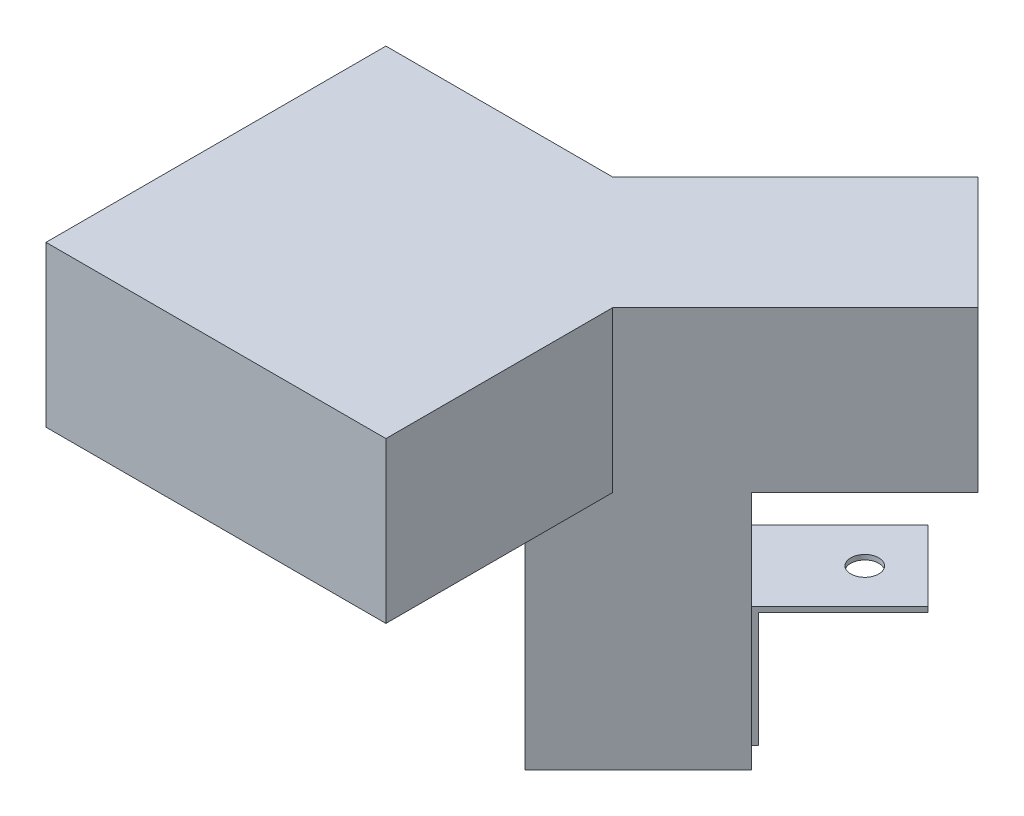
ISO-10303-21;
HEADER;
FILE_DESCRIPTION(('STEP AP214'),'2;1');
FILE_NAME('part.step','',(''),(''),'','','');
FILE_SCHEMA(('AUTOMOTIVE_DESIGN { 1 0 10303 214 1 1 1 1 }'));
ENDSEC;
DATA;
#1=APPLICATION_CONTEXT('core data for automotive mechanical design processes');
#2=APPLICATION_PROTOCOL_DEFINITION('international standard','automotive_design',2000,#1);
#3=PRODUCT_CONTEXT('',#1,'mechanical');
#4=PRODUCT('Part','Part','',(#3));
#5=PRODUCT_RELATED_PRODUCT_CATEGORY('part','',(#4));
#6=PRODUCT_DEFINITION_FORMATION('','',#4);
#7=PRODUCT_DEFINITION_CONTEXT('part definition',#1,'design');
#8=PRODUCT_DEFINITION('design','',#6,#7);
#9=PRODUCT_DEFINITION_SHAPE('','',#8);
#10=(LENGTH_UNIT() NAMED_UNIT(*) SI_UNIT(.MILLI.,.METRE.));
#11=(NAMED_UNIT(*) PLANE_ANGLE_UNIT() SI_UNIT($,.RADIAN.));
#12=(NAMED_UNIT(*) SI_UNIT($,.STERADIAN.) SOLID_ANGLE_UNIT());
#13=UNCERTAINTY_MEASURE_WITH_UNIT(LENGTH_MEASURE(1.E-05),#10,'distance_accuracy_value','');
#14=(GEOMETRIC_REPRESENTATION_CONTEXT(3) GLOBAL_UNCERTAINTY_ASSIGNED_CONTEXT((#13)) GLOBAL_UNIT_ASSIGNED_CONTEXT((#10,
#11,#12)) REPRESENTATION_CONTEXT('',''));
#15=CARTESIAN_POINT('',(0.,0.,0.));
#16=DIRECTION('',(0.,0.,1.));
#17=DIRECTION('',(1.,0.,0.));
#18=AXIS2_PLACEMENT_3D('',#15,#16,#17);
#19=CARTESIAN_POINT('',(-435.867200615114,0.,435.867200615114));
#20=DIRECTION('',(0.707106781186548,0.,-0.707106781186548));
#21=DIRECTION('',(-0.707106781186548,0.,-0.707106781186548));
#22=AXIS2_PLACEMENT_3D('',#19,#20,#21);
#23=PLANE('',#22);
#24=DIRECTION('',(0.,1.,0.));
#25=VECTOR('',#24,1.);
#26=CARTESIAN_POINT('',(-444.706035379946,-130.,427.028365850282));
#27=LINE('',#26,#25);
#28=CARTESIAN_POINT('',(-444.706035379946,-130.,427.028365850282));
#29=VERTEX_POINT('',#28);
#30=CARTESIAN_POINT('',(-444.706035379946,-101.2,427.028365850282));
#31=VERTEX_POINT('',#30);
#32=EDGE_CURVE('E193',#29,#31,#27,.T.);
#33=ORIENTED_EDGE('',*,*,#32,.T.);
#34=DIRECTION('',(-0.707106781186547,0.,-0.707106781186547));
#35=VECTOR('',#34,1.);
#36=CARTESIAN_POINT('',(-444.706035379946,-101.2,427.028365850282));
#37=LINE('',#36,#35);
#38=CARTESIAN_POINT('',(-427.028365850282,-101.2,444.706035379946));
#39=VERTEX_POINT('',#38);
#40=EDGE_CURVE('E179',#39,#31,#37,.T.);
#41=ORIENTED_EDGE('',*,*,#40,.F.);
#42=DIRECTION('',(0.,-1.,0.));
#43=VECTOR('',#42,1.);
#44=CARTESIAN_POINT('',(-427.028365850282,-100.,444.706035379946));
#45=LINE('',#44,#43);
#46=CARTESIAN_POINT('',(-427.028365850282,-130.,444.706035379946));
#47=VERTEX_POINT('',#46);
#48=EDGE_CURVE('E197',#39,#47,#45,.T.);
#49=ORIENTED_EDGE('',*,*,#48,.T.);
#50=DIRECTION('',(-0.707106781186547,0.,-0.707106781186547));
#51=VECTOR('',#50,1.);
#52=CARTESIAN_POINT('',(-427.028365850282,-130.,444.706035379946));
#53=LINE('',#52,#51);
#54=EDGE_CURVE('E190',#47,#29,#53,.T.);
#55=ORIENTED_EDGE('',*,*,#54,.T.);
#56=EDGE_LOOP('',(#33,#41,#49,#55));
#57=FACE_BOUND('',#56,.T.);
#58=ADVANCED_FACE('F34',(#57),#23,.T.);
#59=CARTESIAN_POINT('',(-450.857864376269,-130.,422.573593128807));
#60=DIRECTION('',(0.707106781186547,0.,-0.707106781186548));
#61=DIRECTION('',(-0.707106781186548,0.,-0.707106781186547));
#62=AXIS2_PLACEMENT_3D('',#59,#60,#61);
#63=PLANE('',#62);
#64=DIRECTION('',(-0.707106781186547,0.,-0.707106781186547));
#65=VECTOR('',#64,1.);
#66=CARTESIAN_POINT('',(-427.876893987706,-100.,445.55456351737));
#67=LINE('',#66,#65);
#68=CARTESIAN_POINT('',(-427.876893987706,-100.,445.55456351737));
#69=VERTEX_POINT('',#68);
#70=CARTESIAN_POINT('',(-445.55456351737,-100.,427.876893987706));
#71=VERTEX_POINT('',#70);
#72=EDGE_CURVE('E200',#69,#71,#67,.T.);
#73=ORIENTED_EDGE('',*,*,#72,.T.);
#74=DIRECTION('',(0.,1.,0.));
#75=VECTOR('',#74,1.);
#76=CARTESIAN_POINT('',(-445.55456351737,-130.,427.876893987706));
#77=LINE('',#76,#75);
#78=CARTESIAN_POINT('',(-445.55456351737,-130.,427.876893987706));
#79=VERTEX_POINT('',#78);
#80=EDGE_CURVE('E162',#79,#71,#77,.T.);
#81=ORIENTED_EDGE('',*,*,#80,.F.);
#82=DIRECTION('',(0.707106781186548,0.,0.707106781186547));
#83=VECTOR('',#82,1.);
#84=CARTESIAN_POINT('',(-450.857864376269,-130.,422.573593128807));
#85=LINE('',#84,#83);
#86=CARTESIAN_POINT('',(-450.857864376269,-130.,422.573593128807));
#87=VERTEX_POINT('',#86);
#88=EDGE_CURVE('E281',#87,#79,#85,.T.);
#89=ORIENTED_EDGE('',*,*,#88,.F.);
#90=DIRECTION('',(0.,1.,0.));
#91=VECTOR('',#90,1.);
#92=CARTESIAN_POINT('',(-450.857864376269,-130.,422.573593128807));
#93=LINE('',#92,#91);
#94=CARTESIAN_POINT('',(-450.857864376269,-70.,422.573593128807));
#95=VERTEX_POINT('',#94);
#96=EDGE_CURVE('E261',#87,#95,#93,.T.);
#97=ORIENTED_EDGE('',*,*,#96,.T.);
#98=DIRECTION('',(0.707106781186548,0.,0.707106781186547));
#99=VECTOR('',#98,1.);
#100=CARTESIAN_POINT('',(-450.857864376269,-70.,422.573593128807));
#101=LINE('',#100,#99);
#102=CARTESIAN_POINT('',(-422.573593128807,-70.,450.857864376269));
#103=VERTEX_POINT('',#102);
#104=EDGE_CURVE('E279',#95,#103,#101,.T.);
#105=ORIENTED_EDGE('',*,*,#104,.T.);
#106=DIRECTION('',(0.,1.,0.));
#107=VECTOR('',#106,1.);
#108=CARTESIAN_POINT('',(-422.573593128807,-130.,450.857864376269));
#109=LINE('',#108,#107);
#110=CARTESIAN_POINT('',(-422.573593128807,-130.,450.857864376269));
#111=VERTEX_POINT('',#110);
#112=EDGE_CURVE('E244',#111,#103,#109,.T.);
#113=ORIENTED_EDGE('',*,*,#112,.F.);
#114=CARTESIAN_POINT('',(-427.876893987706,-130.,445.55456351737));
#115=VERTEX_POINT('',#114);
#116=EDGE_CURVE('E284',#115,#111,#85,.T.);
#117=ORIENTED_EDGE('',*,*,#116,.F.);
#118=DIRECTION('',(0.,-1.,0.));
#119=VECTOR('',#118,1.);
#120=CARTESIAN_POINT('',(-427.876893987706,-100.,445.55456351737));
#121=LINE('',#120,#119);
#122=EDGE_CURVE('E194',#69,#115,#121,.T.);
#123=ORIENTED_EDGE('',*,*,#122,.F.);
#124=EDGE_LOOP('',(#73,#81,#89,#97,#105,#113,#117,#123));
#125=FACE_BOUND('',#124,.T.);
#126=ADVANCED_FACE('F335',(#125),#63,.T.);
#127=CARTESIAN_POINT('',(-479.142135623731,-30.,450.857864376269));
#128=DIRECTION('',(-0.707106781186547,0.,0.707106781186548));
#129=DIRECTION('',(0.707106781186548,0.,0.707106781186547));
#130=AXIS2_PLACEMENT_3D('',#127,#128,#129);
#131=PLANE('',#130);
#132=DIRECTION('',(0.,-1.,0.));
#133=VECTOR('',#132,1.);
#134=CARTESIAN_POINT('',(-450.857864376269,-30.,479.142135623731));
#135=LINE('',#134,#133);
#136=CARTESIAN_POINT('',(-450.857864376269,-70.,479.142135623731));
#137=VERTEX_POINT('',#136);
#138=CARTESIAN_POINT('',(-450.857864376269,-130.,479.142135623731));
#139=VERTEX_POINT('',#138);
#140=EDGE_CURVE('E239',#137,#139,#135,.T.);
#141=ORIENTED_EDGE('',*,*,#140,.F.);
#142=DIRECTION('',(-0.707106781186548,0.,-0.707106781186547));
#143=VECTOR('',#142,1.);
#144=CARTESIAN_POINT('',(-479.142135623731,-70.,450.857864376269));
#145=LINE('',#144,#143);
#146=CARTESIAN_POINT('',(-479.142135623731,-70.,450.857864376269));
#147=VERTEX_POINT('',#146);
#148=EDGE_CURVE('E230',#137,#147,#145,.T.);
#149=ORIENTED_EDGE('',*,*,#148,.T.);
#150=DIRECTION('',(0.,-1.,0.));
#151=VECTOR('',#150,1.);
#152=CARTESIAN_POINT('',(-479.142135623731,-30.,450.857864376269));
#153=LINE('',#152,#151);
#154=CARTESIAN_POINT('',(-479.142135623731,-130.,450.857864376269));
#155=VERTEX_POINT('',#154);
#156=EDGE_CURVE('E256',#147,#155,#153,.T.);
#157=ORIENTED_EDGE('',*,*,#156,.T.);
#158=DIRECTION('',(0.707106781186548,0.,0.707106781186547));
#159=VECTOR('',#158,1.);
#160=CARTESIAN_POINT('',(-479.142135623731,-130.,450.857864376269));
#161=LINE('',#160,#159);
#162=EDGE_CURVE('E273',#155,#139,#161,.T.);
#163=ORIENTED_EDGE('',*,*,#162,.T.);
#164=EDGE_LOOP('',(#141,#149,#157,#163));
#165=FACE_BOUND('',#164,.T.);
#166=ADVANCED_FACE('F36',(#165),#131,.T.);
#167=CARTESIAN_POINT('',(-14.1421356237314,0.,-14.1421356237314));
#168=DIRECTION('',(0.707106781186548,0.,0.707106781186547));
#169=DIRECTION('',(0.707106781186547,0.,-0.707106781186548));
#170=AXIS2_PLACEMENT_3D('',#167,#168,#169);
#171=PLANE('',#170);
#172=DIRECTION('',(0.,-1.,0.));
#173=VECTOR('',#172,1.);
#174=CARTESIAN_POINT('',(-468.215432696414,-2.52061314638776E-13,439.931161448952));
#175=LINE('',#174,#173);
#176=CARTESIAN_POINT('',(-468.215432696414,-30.,439.931161448952));
#177=VERTEX_POINT('',#176);
#178=CARTESIAN_POINT('',(-468.215432696414,-70.,439.931161448952));
#179=VERTEX_POINT('',#178);
#180=EDGE_CURVE('E11',#177,#179,#175,.T.);
#181=ORIENTED_EDGE('',*,*,#180,.F.);
#182=DIRECTION('',(-0.707106781186547,0.,0.707106781186547));
#183=VECTOR('',#182,1.);
#184=CARTESIAN_POINT('',(-422.573593128807,-30.,394.289321881345));
#185=LINE('',#184,#183);
#186=CARTESIAN_POINT('',(-422.573593128807,-30.,394.289321881345));
#187=VERTEX_POINT('',#186);
#188=EDGE_CURVE('E270',#187,#177,#185,.T.);
#189=ORIENTED_EDGE('',*,*,#188,.F.);
#190=DIRECTION('',(0.,1.,0.));
#191=VECTOR('',#190,1.);
#192=CARTESIAN_POINT('',(-422.573593128807,-70.,394.289321881345));
#193=LINE('',#192,#191);
#194=CARTESIAN_POINT('',(-422.573593128807,-70.,394.289321881345));
#195=VERTEX_POINT('',#194);
#196=EDGE_CURVE('E267',#195,#187,#193,.T.);
#197=ORIENTED_EDGE('',*,*,#196,.F.);
#198=DIRECTION('',(0.707106781186547,0.,-0.707106781186547));
#199=VECTOR('',#198,1.);
#200=CARTESIAN_POINT('',(-450.857864376269,-70.,422.573593128807));
#201=LINE('',#200,#199);
#202=EDGE_CURVE('E264',#95,#195,#201,.T.);
#203=ORIENTED_EDGE('',*,*,#202,.F.);
#204=ORIENTED_EDGE('',*,*,#96,.F.);
#205=DIRECTION('',(0.707106781186547,0.,-0.707106781186548));
#206=VECTOR('',#205,1.);
#207=CARTESIAN_POINT('',(-479.142135623731,-130.,450.857864376269));
#208=LINE('',#207,#206);
#209=EDGE_CURVE('E258',#155,#87,#208,.T.);
#210=ORIENTED_EDGE('',*,*,#209,.F.);
#211=ORIENTED_EDGE('',*,*,#156,.F.);
#212=DIRECTION('',(-0.707106781186547,0.,0.707106781186548));
#213=VECTOR('',#212,1.);
#214=CARTESIAN_POINT('',(-14.1421356237314,-70.,-14.1421356237314));
#215=LINE('',#214,#213);
#216=EDGE_CURVE('E237',#179,#147,#215,.T.);
#217=ORIENTED_EDGE('',*,*,#216,.F.);
#218=EDGE_LOOP('',(#181,#189,#197,#203,#204,#210,#211,#217));
#219=FACE_BOUND('',#218,.T.);
#220=ADVANCED_FACE('F310',(#219),#171,.F.);
#221=CARTESIAN_POINT('',(-422.573593128807,-30.,394.289321881345));
#222=DIRECTION('',(0.,1.,0.));
#223=DIRECTION('',(0.,0.,1.));
#224=AXIS2_PLACEMENT_3D('',#221,#222,#223);
#225=PLANE('',#224);
#226=DIRECTION('',(0.,0.,-1.));
#227=VECTOR('',#226,1.);
#228=CARTESIAN_POINT('',(-439.931161448952,-30.,524.842515007635));
#229=LINE('',#228,#227);
#230=CARTESIAN_POINT('',(-439.931161448952,-30.,524.842515007635));
#231=VERTEX_POINT('',#230);
#232=CARTESIAN_POINT('',(-439.931161448952,-30.,468.215432696414));
#233=VERTEX_POINT('',#232);
#234=EDGE_CURVE('E222',#231,#233,#229,.T.);
#235=ORIENTED_EDGE('',*,*,#234,.T.);
#236=DIRECTION('',(-0.707106781186547,0.,0.707106781186547));
#237=VECTOR('',#236,1.);
#238=CARTESIAN_POINT('',(-394.289321881345,-30.,422.573593128807));
#239=LINE('',#238,#237);
#240=CARTESIAN_POINT('',(-394.289321881345,-30.,422.573593128807));
#241=VERTEX_POINT('',#240);
#242=EDGE_CURVE('E253',#241,#233,#239,.T.);
#243=ORIENTED_EDGE('',*,*,#242,.F.);
#244=DIRECTION('',(0.707106781186548,0.,0.707106781186547));
#245=VECTOR('',#244,1.);
#246=CARTESIAN_POINT('',(-422.573593128807,-30.,394.289321881345));
#247=LINE('',#246,#245);
#248=EDGE_CURVE('E274',#187,#241,#247,.T.);
#249=ORIENTED_EDGE('',*,*,#248,.F.);
#250=ORIENTED_EDGE('',*,*,#188,.T.);
#251=DIRECTION('',(1.,0.,0.));
#252=VECTOR('',#251,1.);
#253=CARTESIAN_POINT('',(-524.842515007634,-30.,439.931161448952));
#254=LINE('',#253,#252);
#255=CARTESIAN_POINT('',(-524.842515007634,-30.,439.931161448952));
#256=VERTEX_POINT('',#255);
#257=EDGE_CURVE('E225',#256,#177,#254,.T.);
#258=ORIENTED_EDGE('',*,*,#257,.F.);
#259=DIRECTION('',(0.,0.,-1.));
#260=VECTOR('',#259,1.);
#261=CARTESIAN_POINT('',(-524.842515007634,-30.,524.842515007635));
#262=LINE('',#261,#260);
#263=CARTESIAN_POINT('',(-524.842515007634,-30.,524.842515007635));
#264=VERTEX_POINT('',#263);
#265=EDGE_CURVE('E211',#264,#256,#262,.T.);
#266=ORIENTED_EDGE('',*,*,#265,.F.);
#267=DIRECTION('',(1.,0.,0.));
#268=VECTOR('',#267,1.);
#269=CARTESIAN_POINT('',(-524.842515007634,-30.,524.842515007635));
#270=LINE('',#269,#268);
#271=EDGE_CURVE('E206',#264,#231,#270,.T.);
#272=ORIENTED_EDGE('',*,*,#271,.T.);
#273=EDGE_LOOP('',(#235,#243,#249,#250,#258,#266,#272));
#274=FACE_BOUND('',#273,.T.);
#275=ADVANCED_FACE('F297',(#274),#225,.T.);
#276=CARTESIAN_POINT('',(-422.573593128807,-70.,394.289321881345));
#277=DIRECTION('',(0.707106781186547,0.,-0.707106781186548));
#278=DIRECTION('',(-0.707106781186548,0.,-0.707106781186547));
#279=AXIS2_PLACEMENT_3D('',#276,#277,#278);
#280=PLANE('',#279);
#281=ORIENTED_EDGE('',*,*,#248,.T.);
#282=DIRECTION('',(0.,1.,0.));
#283=VECTOR('',#282,1.);
#284=CARTESIAN_POINT('',(-394.289321881345,-70.,422.573593128807));
#285=LINE('',#284,#283);
#286=CARTESIAN_POINT('',(-394.289321881345,-70.,422.573593128807));
#287=VERTEX_POINT('',#286);
#288=EDGE_CURVE('E250',#287,#241,#285,.T.);
#289=ORIENTED_EDGE('',*,*,#288,.F.);
#290=DIRECTION('',(0.707106781186548,0.,0.707106781186547));
#291=VECTOR('',#290,1.);
#292=CARTESIAN_POINT('',(-422.573593128807,-70.,394.289321881345));
#293=LINE('',#292,#291);
#294=EDGE_CURVE('E277',#195,#287,#293,.T.);
#295=ORIENTED_EDGE('',*,*,#294,.F.);
#296=ORIENTED_EDGE('',*,*,#196,.T.);
#297=EDGE_LOOP('',(#281,#289,#295,#296));
#298=FACE_BOUND('',#297,.T.);
#299=ADVANCED_FACE('F304',(#298),#280,.T.);
#300=CARTESIAN_POINT('',(-450.857864376269,-70.,422.573593128807));
#301=DIRECTION('',(0.,-1.,0.));
#302=DIRECTION('',(0.,0.,-1.));
#303=AXIS2_PLACEMENT_3D('',#300,#301,#302);
#304=PLANE('',#303);
#305=ORIENTED_EDGE('',*,*,#294,.T.);
#306=DIRECTION('',(0.707106781186547,0.,-0.707106781186547));
#307=VECTOR('',#306,1.);
#308=CARTESIAN_POINT('',(-422.573593128807,-70.,450.857864376269));
#309=LINE('',#308,#307);
#310=EDGE_CURVE('E247',#103,#287,#309,.T.);
#311=ORIENTED_EDGE('',*,*,#310,.F.);
#312=ORIENTED_EDGE('',*,*,#104,.F.);
#313=ORIENTED_EDGE('',*,*,#202,.T.);
#314=EDGE_LOOP('',(#305,#311,#312,#313));
#315=FACE_BOUND('',#314,.T.);
#316=ADVANCED_FACE('F339',(#315),#304,.T.);
#317=CARTESIAN_POINT('',(-479.142135623731,-130.,450.857864376269));
#318=DIRECTION('',(0.,-1.,0.));
#319=DIRECTION('',(0.,0.,-1.));
#320=AXIS2_PLACEMENT_3D('',#317,#318,#319);
#321=PLANE('',#320);
#322=ORIENTED_EDGE('',*,*,#88,.T.);
#323=DIRECTION('',(-0.707106781186548,0.,0.707106781186548));
#324=VECTOR('',#323,1.);
#325=CARTESIAN_POINT('',(-444.706035379946,-130.,427.028365850282));
#326=LINE('',#325,#324);
#327=EDGE_CURVE('E166',#29,#79,#326,.T.);
#328=ORIENTED_EDGE('',*,*,#327,.F.);
#329=ORIENTED_EDGE('',*,*,#54,.F.);
#330=DIRECTION('',(-0.707106781186548,0.,0.707106781186548));
#331=VECTOR('',#330,1.);
#332=CARTESIAN_POINT('',(-427.028365850282,-130.,444.706035379946));
#333=LINE('',#332,#331);
#334=EDGE_CURVE('E58',#47,#115,#333,.T.);
#335=ORIENTED_EDGE('',*,*,#334,.T.);
#336=ORIENTED_EDGE('',*,*,#116,.T.);
#337=DIRECTION('',(0.707106781186547,0.,-0.707106781186548));
#338=VECTOR('',#337,1.);
#339=CARTESIAN_POINT('',(-450.857864376269,-130.,479.142135623731));
#340=LINE('',#339,#338);
#341=EDGE_CURVE('E241',#139,#111,#340,.T.);
#342=ORIENTED_EDGE('',*,*,#341,.F.);
#343=ORIENTED_EDGE('',*,*,#162,.F.);
#344=ORIENTED_EDGE('',*,*,#209,.T.);
#345=EDGE_LOOP('',(#322,#328,#329,#335,#336,#342,#343,#344));
#346=FACE_BOUND('',#345,.T.);
#347=ADVANCED_FACE('F331',(#346),#321,.T.);
#348=CARTESIAN_POINT('',(14.1421356237305,0.,14.1421356237305));
#349=DIRECTION('',(0.707106781186548,0.,0.707106781186547));
#350=DIRECTION('',(0.707106781186547,0.,-0.707106781186548));
#351=AXIS2_PLACEMENT_3D('',#348,#349,#350);
#352=PLANE('',#351);
#353=DIRECTION('',(0.,1.,0.));
#354=VECTOR('',#353,1.);
#355=CARTESIAN_POINT('',(-439.931161448952,2.52061314638777E-13,468.215432696414));
#356=LINE('',#355,#354);
#357=CARTESIAN_POINT('',(-439.931161448952,-70.,468.215432696414));
#358=VERTEX_POINT('',#357);
#359=EDGE_CURVE('E43',#358,#233,#356,.T.);
#360=ORIENTED_EDGE('',*,*,#359,.F.);
#361=DIRECTION('',(-0.707106781186547,0.,0.707106781186548));
#362=VECTOR('',#361,1.);
#363=CARTESIAN_POINT('',(14.1421356237305,-70.,14.1421356237305));
#364=LINE('',#363,#362);
#365=EDGE_CURVE('E276',#358,#137,#364,.T.);
#366=ORIENTED_EDGE('',*,*,#365,.T.);
#367=ORIENTED_EDGE('',*,*,#140,.T.);
#368=ORIENTED_EDGE('',*,*,#341,.T.);
#369=ORIENTED_EDGE('',*,*,#112,.T.);
#370=ORIENTED_EDGE('',*,*,#310,.T.);
#371=ORIENTED_EDGE('',*,*,#288,.T.);
#372=ORIENTED_EDGE('',*,*,#242,.T.);
#373=EDGE_LOOP('',(#360,#366,#367,#368,#369,#370,#371,#372));
#374=FACE_BOUND('',#373,.T.);
#375=ADVANCED_FACE('F300',(#374),#352,.T.);
#376=CARTESIAN_POINT('',(-524.842515007634,-70.,439.931161448952));
#377=DIRECTION('',(0.,0.,1.));
#378=DIRECTION('',(1.,0.,0.));
#379=AXIS2_PLACEMENT_3D('',#376,#377,#378);
#380=PLANE('',#379);
#381=ORIENTED_EDGE('',*,*,#257,.T.);
#382=ORIENTED_EDGE('',*,*,#180,.T.);
#383=DIRECTION('',(1.,0.,0.));
#384=VECTOR('',#383,1.);
#385=CARTESIAN_POINT('',(-524.842515007634,-70.,439.931161448952));
#386=LINE('',#385,#384);
#387=CARTESIAN_POINT('',(-524.842515007634,-70.,439.931161448952));
#388=VERTEX_POINT('',#387);
#389=EDGE_CURVE('E214',#388,#179,#386,.T.);
#390=ORIENTED_EDGE('',*,*,#389,.F.);
#391=DIRECTION('',(0.,1.,0.));
#392=VECTOR('',#391,1.);
#393=CARTESIAN_POINT('',(-524.842515007634,-70.,439.931161448952));
#394=LINE('',#393,#392);
#395=EDGE_CURVE('E231',#388,#256,#394,.T.);
#396=ORIENTED_EDGE('',*,*,#395,.T.);
#397=EDGE_LOOP('',(#381,#382,#390,#396));
#398=FACE_BOUND('',#397,.T.);
#399=ADVANCED_FACE('F316',(#398),#380,.F.);
#400=CARTESIAN_POINT('',(0.,-70.,0.));
#401=DIRECTION('',(0.,1.,0.));
#402=DIRECTION('',(0.,0.,1.));
#403=AXIS2_PLACEMENT_3D('',#400,#401,#402);
#404=PLANE('',#403);
#405=ORIENTED_EDGE('',*,*,#389,.T.);
#406=ORIENTED_EDGE('',*,*,#216,.T.);
#407=ORIENTED_EDGE('',*,*,#148,.F.);
#408=ORIENTED_EDGE('',*,*,#365,.F.);
#409=DIRECTION('',(0.,0.,-1.));
#410=VECTOR('',#409,1.);
#411=CARTESIAN_POINT('',(-439.931161448952,-70.,524.842515007635));
#412=LINE('',#411,#410);
#413=CARTESIAN_POINT('',(-439.931161448952,-70.,524.842515007635));
#414=VERTEX_POINT('',#413);
#415=EDGE_CURVE('E210',#414,#358,#412,.T.);
#416=ORIENTED_EDGE('',*,*,#415,.F.);
#417=DIRECTION('',(1.,0.,0.));
#418=VECTOR('',#417,1.);
#419=CARTESIAN_POINT('',(-524.842515007634,-70.,524.842515007635));
#420=LINE('',#419,#418);
#421=CARTESIAN_POINT('',(-524.842515007634,-70.,524.842515007635));
#422=VERTEX_POINT('',#421);
#423=EDGE_CURVE('E207',#422,#414,#420,.T.);
#424=ORIENTED_EDGE('',*,*,#423,.F.);
#425=DIRECTION('',(0.,0.,-1.));
#426=VECTOR('',#425,1.);
#427=CARTESIAN_POINT('',(-524.842515007634,-70.,524.842515007635));
#428=LINE('',#427,#426);
#429=EDGE_CURVE('E217',#422,#388,#428,.T.);
#430=ORIENTED_EDGE('',*,*,#429,.T.);
#431=EDGE_LOOP('',(#405,#406,#407,#408,#416,#424,#430));
#432=FACE_BOUND('',#431,.T.);
#433=ADVANCED_FACE('F318',(#432),#404,.F.);
#434=CARTESIAN_POINT('',(-524.842515007634,-70.,524.842515007635));
#435=DIRECTION('',(0.,0.,1.));
#436=DIRECTION('',(1.,0.,0.));
#437=AXIS2_PLACEMENT_3D('',#434,#435,#436);
#438=PLANE('',#437);
#439=ORIENTED_EDGE('',*,*,#271,.F.);
#440=DIRECTION('',(0.,1.,0.));
#441=VECTOR('',#440,1.);
#442=CARTESIAN_POINT('',(-524.842515007634,-70.,524.842515007635));
#443=LINE('',#442,#441);
#444=EDGE_CURVE('E228',#422,#264,#443,.T.);
#445=ORIENTED_EDGE('',*,*,#444,.F.);
#446=ORIENTED_EDGE('',*,*,#423,.T.);
#447=DIRECTION('',(0.,1.,0.));
#448=VECTOR('',#447,1.);
#449=CARTESIAN_POINT('',(-439.931161448952,-70.,524.842515007635));
#450=LINE('',#449,#448);
#451=EDGE_CURVE('E219',#414,#231,#450,.T.);
#452=ORIENTED_EDGE('',*,*,#451,.T.);
#453=EDGE_LOOP('',(#439,#445,#446,#452));
#454=FACE_BOUND('',#453,.T.);
#455=ADVANCED_FACE('F325',(#454),#438,.T.);
#456=CARTESIAN_POINT('',(-524.842515007634,-70.,524.842515007635));
#457=DIRECTION('',(1.,0.,0.));
#458=DIRECTION('',(0.,0.,-1.));
#459=AXIS2_PLACEMENT_3D('',#456,#457,#458);
#460=PLANE('',#459);
#461=ORIENTED_EDGE('',*,*,#265,.T.);
#462=ORIENTED_EDGE('',*,*,#395,.F.);
#463=ORIENTED_EDGE('',*,*,#429,.F.);
#464=ORIENTED_EDGE('',*,*,#444,.T.);
#465=EDGE_LOOP('',(#461,#462,#463,#464));
#466=FACE_BOUND('',#465,.T.);
#467=ADVANCED_FACE('F323',(#466),#460,.F.);
#468=CARTESIAN_POINT('',(-439.931161448952,-70.,524.842515007635));
#469=DIRECTION('',(1.,0.,0.));
#470=DIRECTION('',(0.,0.,-1.));
#471=AXIS2_PLACEMENT_3D('',#468,#469,#470);
#472=PLANE('',#471);
#473=ORIENTED_EDGE('',*,*,#415,.T.);
#474=ORIENTED_EDGE('',*,*,#359,.T.);
#475=ORIENTED_EDGE('',*,*,#234,.F.);
#476=ORIENTED_EDGE('',*,*,#451,.F.);
#477=EDGE_LOOP('',(#473,#474,#475,#476));
#478=FACE_BOUND('',#477,.T.);
#479=ADVANCED_FACE('F292',(#478),#472,.T.);
#480=CARTESIAN_POINT('',(-444.706035379946,-130.,427.028365850282));
#481=DIRECTION('',(0.707106781186548,0.,0.707106781186548));
#482=DIRECTION('',(0.707106781186548,0.,-0.707106781186548));
#483=AXIS2_PLACEMENT_3D('',#480,#481,#482);
#484=PLANE('',#483);
#485=ORIENTED_EDGE('',*,*,#80,.T.);
#486=DIRECTION('',(-0.707106781186548,0.,0.707106781186548));
#487=VECTOR('',#486,1.);
#488=CARTESIAN_POINT('',(-444.706035379946,-100.,427.028365850282));
#489=LINE('',#488,#487);
#490=CARTESIAN_POINT('',(-423.49283194435,-100.,405.815162414686));
#491=VERTEX_POINT('',#490);
#492=EDGE_CURVE('E155',#491,#71,#489,.T.);
#493=ORIENTED_EDGE('',*,*,#492,.F.);
#494=DIRECTION('',(0.,1.,0.));
#495=VECTOR('',#494,1.);
#496=CARTESIAN_POINT('',(-423.49283194435,-100.,405.815162414686));
#497=LINE('',#496,#495);
#498=CARTESIAN_POINT('',(-423.49283194435,-101.2,405.815162414686));
#499=VERTEX_POINT('',#498);
#500=EDGE_CURVE('E160',#499,#491,#497,.T.);
#501=ORIENTED_EDGE('',*,*,#500,.F.);
#502=DIRECTION('',(-0.707106781186548,0.,0.707106781186547));
#503=VECTOR('',#502,1.);
#504=CARTESIAN_POINT('',(-423.49283194435,-101.2,405.815162414686));
#505=LINE('',#504,#503);
#506=EDGE_CURVE('E186',#499,#31,#505,.T.);
#507=ORIENTED_EDGE('',*,*,#506,.T.);
#508=ORIENTED_EDGE('',*,*,#32,.F.);
#509=ORIENTED_EDGE('',*,*,#327,.T.);
#510=EDGE_LOOP('',(#485,#493,#501,#507,#508,#509));
#511=FACE_BOUND('',#510,.T.);
#512=ADVANCED_FACE('F157',(#511),#484,.F.);
#513=CARTESIAN_POINT('',(-427.028365850282,-100.,444.706035379946));
#514=DIRECTION('',(0.,1.,0.));
#515=DIRECTION('',(0.,0.,1.));
#516=AXIS2_PLACEMENT_3D('',#513,#514,#515);
#517=PLANE('',#516);
#518=CARTESIAN_POINT('',(-422.573593128807,-100.,422.573593128807));
#519=DIRECTION('',(0.,1.,0.));
#520=DIRECTION('',(0.,0.,1.));
#521=AXIS2_PLACEMENT_3D('',#518,#519,#520);
#522=CIRCLE('',#521,3.50000000000002);
#523=CARTESIAN_POINT('',(-422.573593128807,-100.,426.073593128807));
#524=VERTEX_POINT('',#523);
#525=EDGE_CURVE('E183',#524,#524,#522,.T.);
#526=ORIENTED_EDGE('',*,*,#525,.F.);
#527=EDGE_LOOP('',(#526));
#528=FACE_BOUND('',#527,.T.);
#529=ORIENTED_EDGE('',*,*,#72,.F.);
#530=DIRECTION('',(-0.707106781186548,0.,0.707106781186548));
#531=VECTOR('',#530,1.);
#532=CARTESIAN_POINT('',(-427.028365850282,-100.,444.706035379946));
#533=LINE('',#532,#531);
#534=CARTESIAN_POINT('',(-405.815162414686,-100.,423.49283194435));
#535=VERTEX_POINT('',#534);
#536=EDGE_CURVE('E167',#535,#69,#533,.T.);
#537=ORIENTED_EDGE('',*,*,#536,.F.);
#538=DIRECTION('',(0.707106781186547,0.,0.707106781186547));
#539=VECTOR('',#538,1.);
#540=CARTESIAN_POINT('',(-423.49283194435,-100.,405.815162414686));
#541=LINE('',#540,#539);
#542=EDGE_CURVE('E170',#491,#535,#541,.T.);
#543=ORIENTED_EDGE('',*,*,#542,.F.);
#544=ORIENTED_EDGE('',*,*,#492,.T.);
#545=EDGE_LOOP('',(#529,#537,#543,#544));
#546=FACE_BOUND('',#545,.T.);
#547=ADVANCED_FACE('F171',(#528,#546),#517,.T.);
#548=CARTESIAN_POINT('',(-427.028365850282,-100.,444.706035379946));
#549=DIRECTION('',(-0.707106781186548,0.,-0.707106781186548));
#550=DIRECTION('',(-0.707106781186548,0.,0.707106781186548));
#551=AXIS2_PLACEMENT_3D('',#548,#549,#550);
#552=PLANE('',#551);
#553=ORIENTED_EDGE('',*,*,#122,.T.);
#554=ORIENTED_EDGE('',*,*,#334,.F.);
#555=ORIENTED_EDGE('',*,*,#48,.F.);
#556=DIRECTION('',(-0.707106781186548,0.,0.707106781186547));
#557=VECTOR('',#556,1.);
#558=CARTESIAN_POINT('',(-405.815162414686,-101.2,423.49283194435));
#559=LINE('',#558,#557);
#560=CARTESIAN_POINT('',(-405.815162414686,-101.2,423.49283194435));
#561=VERTEX_POINT('',#560);
#562=EDGE_CURVE('E50',#561,#39,#559,.T.);
#563=ORIENTED_EDGE('',*,*,#562,.F.);
#564=DIRECTION('',(0.,-1.,0.));
#565=VECTOR('',#564,1.);
#566=CARTESIAN_POINT('',(-405.815162414686,-100.,423.49283194435));
#567=LINE('',#566,#565);
#568=EDGE_CURVE('E174',#535,#561,#567,.T.);
#569=ORIENTED_EDGE('',*,*,#568,.F.);
#570=ORIENTED_EDGE('',*,*,#536,.T.);
#571=EDGE_LOOP('',(#553,#554,#555,#563,#569,#570));
#572=FACE_BOUND('',#571,.T.);
#573=ADVANCED_FACE('F342',(#572),#552,.F.);
#574=CARTESIAN_POINT('',(-423.49283194435,-101.2,405.815162414686));
#575=DIRECTION('',(0.,1.,0.));
#576=DIRECTION('',(0.,0.,1.));
#577=AXIS2_PLACEMENT_3D('',#574,#575,#576);
#578=PLANE('',#577);
#579=CARTESIAN_POINT('',(-422.573593128807,-101.2,422.573593128807));
#580=DIRECTION('',(0.,1.,0.));
#581=DIRECTION('',(0.,0.,1.));
#582=AXIS2_PLACEMENT_3D('',#579,#580,#581);
#583=CIRCLE('',#582,3.50000000000002);
#584=CARTESIAN_POINT('',(-422.573593128807,-101.2,426.073593128807));
#585=VERTEX_POINT('',#584);
#586=EDGE_CURVE('E38',#585,#585,#583,.T.);
#587=ORIENTED_EDGE('',*,*,#586,.T.);
#588=EDGE_LOOP('',(#587));
#589=FACE_BOUND('',#588,.T.);
#590=ORIENTED_EDGE('',*,*,#40,.T.);
#591=ORIENTED_EDGE('',*,*,#506,.F.);
#592=DIRECTION('',(-0.707106781186547,0.,-0.707106781186547));
#593=VECTOR('',#592,1.);
#594=CARTESIAN_POINT('',(-423.49283194435,-101.2,405.815162414686));
#595=LINE('',#594,#593);
#596=EDGE_CURVE('E177',#561,#499,#595,.T.);
#597=ORIENTED_EDGE('',*,*,#596,.F.);
#598=ORIENTED_EDGE('',*,*,#562,.T.);
#599=EDGE_LOOP('',(#590,#591,#597,#598));
#600=FACE_BOUND('',#599,.T.);
#601=ADVANCED_FACE('F344',(#589,#600),#578,.F.);
#602=CARTESIAN_POINT('',(-414.653997179518,0.,414.653997179518));
#603=DIRECTION('',(-0.707106781186548,0.,0.707106781186548));
#604=DIRECTION('',(0.707106781186548,0.,0.707106781186548));
#605=AXIS2_PLACEMENT_3D('',#602,#603,#604);
#606=PLANE('',#605);
#607=ORIENTED_EDGE('',*,*,#500,.T.);
#608=ORIENTED_EDGE('',*,*,#542,.T.);
#609=ORIENTED_EDGE('',*,*,#568,.T.);
#610=ORIENTED_EDGE('',*,*,#596,.T.);
#611=EDGE_LOOP('',(#607,#608,#609,#610));
#612=FACE_BOUND('',#611,.T.);
#613=ADVANCED_FACE('F176',(#612),#606,.F.);
#614=CARTESIAN_POINT('',(-422.573593128807,-130.,422.573593128807));
#615=DIRECTION('',(0.,1.,0.));
#616=DIRECTION('',(0.,0.,1.));
#617=AXIS2_PLACEMENT_3D('',#614,#615,#616);
#618=CYLINDRICAL_SURFACE('',#617,3.50000000000002);
#619=ORIENTED_EDGE('',*,*,#525,.T.);
#620=EDGE_LOOP('',(#619));
#621=FACE_BOUND('',#620,.T.);
#622=ORIENTED_EDGE('',*,*,#586,.F.);
#623=EDGE_LOOP('',(#622));
#624=FACE_BOUND('',#623,.T.);
#625=ADVANCED_FACE('F445',(#621,#624),#618,.F.);
#626=CLOSED_SHELL('',(#58,#126,#166,#220,#275,#299,#316,#347,#375,#399,#433,#455,#467,#479,#512,
#547,#573,#601,#613,#625));
#627=MANIFOLD_SOLID_BREP('B2',#626);
#628=ADVANCED_BREP_SHAPE_REPRESENTATION('',(#18,#627),#14);
#629=SHAPE_DEFINITION_REPRESENTATION(#9,#628);
ENDSEC;
END-ISO-10303-21;
